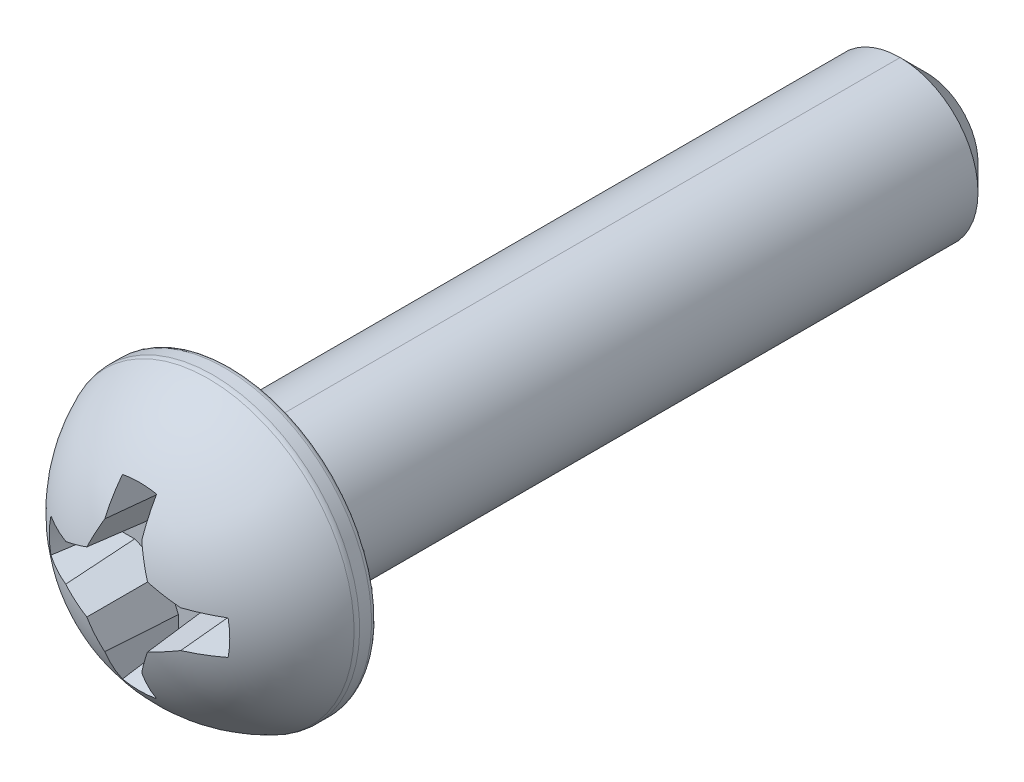
ISO-10303-21;
HEADER;
FILE_DESCRIPTION(('STEP AP214'),'2;1');
FILE_NAME('part.step','',(''),(''),'','','');
FILE_SCHEMA(('AUTOMOTIVE_DESIGN { 1 0 10303 214 1 1 1 1 }'));
ENDSEC;
DATA;
#1=APPLICATION_CONTEXT('core data for automotive mechanical design processes');
#2=APPLICATION_PROTOCOL_DEFINITION('international standard','automotive_design',2000,#1);
#3=PRODUCT_CONTEXT('',#1,'mechanical');
#4=PRODUCT('Part','Part','',(#3));
#5=PRODUCT_RELATED_PRODUCT_CATEGORY('part','',(#4));
#6=PRODUCT_DEFINITION_FORMATION('','',#4);
#7=PRODUCT_DEFINITION_CONTEXT('part definition',#1,'design');
#8=PRODUCT_DEFINITION('design','',#6,#7);
#9=PRODUCT_DEFINITION_SHAPE('','',#8);
#10=(LENGTH_UNIT() NAMED_UNIT(*) SI_UNIT(.MILLI.,.METRE.));
#11=(NAMED_UNIT(*) PLANE_ANGLE_UNIT() SI_UNIT($,.RADIAN.));
#12=(NAMED_UNIT(*) SI_UNIT($,.STERADIAN.) SOLID_ANGLE_UNIT());
#13=UNCERTAINTY_MEASURE_WITH_UNIT(LENGTH_MEASURE(1.E-05),#10,'distance_accuracy_value','');
#14=(GEOMETRIC_REPRESENTATION_CONTEXT(3) GLOBAL_UNCERTAINTY_ASSIGNED_CONTEXT((#13)) GLOBAL_UNIT_ASSIGNED_CONTEXT((#10,
#11,#12)) REPRESENTATION_CONTEXT('',''));
#15=CARTESIAN_POINT('',(0.,0.,0.));
#16=DIRECTION('',(0.,0.,1.));
#17=DIRECTION('',(1.,0.,0.));
#18=AXIS2_PLACEMENT_3D('',#15,#16,#17);
#19=CARTESIAN_POINT('',(0.,0.,2.1844));
#20=DIRECTION('',(0.,0.,-1.));
#21=DIRECTION('',(-1.,0.,0.));
#22=AXIS2_PLACEMENT_3D('',#19,#20,#21);
#23=CYLINDRICAL_SURFACE('',#22,2.6797);
#24=CARTESIAN_POINT('',(0.,0.,0.327659999999998));
#25=DIRECTION('',(0.,0.,-1.));
#26=DIRECTION('',(0.,1.,0.));
#27=AXIS2_PLACEMENT_3D('',#24,#25,#26);
#28=CIRCLE('',#27,2.6797);
#29=CARTESIAN_POINT('',(0.,2.6797,0.327659999999998));
#30=VERTEX_POINT('',#29);
#31=EDGE_CURVE('E432',#30,#30,#28,.T.);
#32=ORIENTED_EDGE('',*,*,#31,.T.);
#33=EDGE_LOOP('',(#32));
#34=FACE_BOUND('',#33,.T.);
#35=CARTESIAN_POINT('',(0.,0.,0.109219999999998));
#36=DIRECTION('',(0.,0.,-1.));
#37=DIRECTION('',(0.,1.,0.));
#38=AXIS2_PLACEMENT_3D('',#35,#36,#37);
#39=CIRCLE('',#38,2.6797);
#40=CARTESIAN_POINT('',(0.,2.6797,0.109219999999998));
#41=VERTEX_POINT('',#40);
#42=EDGE_CURVE('E430',#41,#41,#39,.T.);
#43=ORIENTED_EDGE('',*,*,#42,.F.);
#44=EDGE_LOOP('',(#43));
#45=FACE_BOUND('',#44,.T.);
#46=ADVANCED_FACE('F38',(#34,#45),#23,.T.);
#47=CARTESIAN_POINT('',(0.,0.,0.109219999999998));
#48=DIRECTION('',(0.,0.,-1.));
#49=DIRECTION('',(0.,1.,0.));
#50=AXIS2_PLACEMENT_3D('',#47,#48,#49);
#51=TOROIDAL_SURFACE('',#50,2.57048,0.10922);
#52=CARTESIAN_POINT('',(0.,0.,0.));
#53=DIRECTION('',(0.,0.,-1.));
#54=DIRECTION('',(0.,1.,0.));
#55=AXIS2_PLACEMENT_3D('',#52,#53,#54);
#56=CIRCLE('',#55,2.57048);
#57=CARTESIAN_POINT('',(0.,2.57048,0.));
#58=VERTEX_POINT('',#57);
#59=EDGE_CURVE('E444',#58,#58,#56,.T.);
#60=ORIENTED_EDGE('',*,*,#59,.F.);
#61=EDGE_LOOP('',(#60));
#62=FACE_BOUND('',#61,.T.);
#63=ORIENTED_EDGE('',*,*,#42,.T.);
#64=EDGE_LOOP('',(#63));
#65=FACE_BOUND('',#64,.T.);
#66=ADVANCED_FACE('F488',(#62,#65),#51,.T.);
#67=CARTESIAN_POINT('',(0.,0.,0.327659999999998));
#68=DIRECTION('',(0.,0.,-1.));
#69=DIRECTION('',(0.,1.,0.));
#70=AXIS2_PLACEMENT_3D('',#67,#68,#69);
#71=TOROIDAL_SURFACE('',#70,2.46126,0.21844);
#72=ORIENTED_EDGE('',*,*,#31,.F.);
#73=EDGE_LOOP('',(#72));
#74=FACE_BOUND('',#73,.T.);
#75=CARTESIAN_POINT('',(0.,0.,0.411963557261845));
#76=DIRECTION('',(0.,0.,-1.));
#77=DIRECTION('',(0.,1.,0.));
#78=AXIS2_PLACEMENT_3D('',#75,#76,#77);
#79=CIRCLE('',#78,2.6627766093229);
#80=CARTESIAN_POINT('',(0.,2.6627766093229,0.411963557261845));
#81=VERTEX_POINT('',#80);
#82=EDGE_CURVE('E441',#81,#81,#79,.T.);
#83=ORIENTED_EDGE('',*,*,#82,.T.);
#84=EDGE_LOOP('',(#83));
#85=FACE_BOUND('',#84,.T.);
#86=ADVANCED_FACE('F493',(#74,#85),#71,.T.);
#87=CARTESIAN_POINT('',(0.,0.,-0.701996930232557));
#88=DIRECTION('',(0.,0.,-1.));
#89=DIRECTION('',(0.,1.,0.));
#90=AXIS2_PLACEMENT_3D('',#87,#88,#89);
#91=SPHERICAL_SURFACE('',#90,2.88639693023256);
#92=CARTESIAN_POINT('',(-0.103970505570633,0.,-0.711093170811046));
#93=DIRECTION('',(0.996194698091746,0.,0.0871557427476584));
#94=DIRECTION('',(0.0871557427476584,0.,-0.996194698091746));
#95=AXIS2_PLACEMENT_3D('',#92,#93,#94);
#96=CIRCLE('',#95,2.88450942644233);
#97=CARTESIAN_POINT('',(-0.338123662597537,1.05001993724353,1.96528966086309));
#98=VERTEX_POINT('',#97);
#99=CARTESIAN_POINT('',(-0.312085803117818,1.61819095132128,1.66767556515793));
#100=VERTEX_POINT('',#99);
#101=EDGE_CURVE('E11',#98,#100,#96,.F.);
#102=ORIENTED_EDGE('',*,*,#101,.T.);
#103=CARTESIAN_POINT('',(0.,0.,1.66767556515793));
#104=DIRECTION('',(0.,0.,-1.));
#105=DIRECTION('',(-1.,0.,0.));
#106=AXIS2_PLACEMENT_3D('',#103,#104,#105);
#107=CIRCLE('',#106,1.6480107716413);
#108=CARTESIAN_POINT('',(0.312085803117812,1.61819095132128,1.66767556515793));
#109=VERTEX_POINT('',#108);
#110=EDGE_CURVE('E423',#100,#109,#107,.T.);
#111=ORIENTED_EDGE('',*,*,#110,.T.);
#112=CARTESIAN_POINT('',(0.103970505570634,0.,-0.711093170811047));
#113=DIRECTION('',(-0.996194698091746,0.,0.0871557427476584));
#114=DIRECTION('',(0.0871557427476584,0.,0.996194698091746));
#115=AXIS2_PLACEMENT_3D('',#112,#113,#114);
#116=CIRCLE('',#115,2.88450942644233);
#117=CARTESIAN_POINT('',(0.338123662597533,1.05001993724353,1.96528966086309));
#118=VERTEX_POINT('',#117);
#119=EDGE_CURVE('E420',#109,#118,#116,.F.);
#120=ORIENTED_EDGE('',*,*,#119,.T.);
#121=CARTESIAN_POINT('',(0.440876055590451,0.18261684155112,-0.743746590796358));
#122=DIRECTION('',(-0.920363891963224,-0.381227206369654,0.0871557427476584));
#123=DIRECTION('',(0.38268343236509,-0.923879532511287,0.));
#124=AXIS2_PLACEMENT_3D('',#121,#122,#123);
#125=CIRCLE('',#124,2.84637024954373);
#126=CARTESIAN_POINT('',(0.554047520679546,0.554047520679546,2.07601493592526));
#127=VERTEX_POINT('',#126);
#128=EDGE_CURVE('E424',#118,#127,#125,.F.);
#129=ORIENTED_EDGE('',*,*,#128,.T.);
#130=CARTESIAN_POINT('',(0.18261684155112,0.44087605559045,-0.743746590796358));
#131=DIRECTION('',(-0.381227206369654,-0.920363891963224,0.0871557427476584));
#132=DIRECTION('',(0.923879532511287,-0.382683432365091,0.));
#133=AXIS2_PLACEMENT_3D('',#130,#131,#132);
#134=CIRCLE('',#133,2.84637024954373);
#135=CARTESIAN_POINT('',(1.05001993724353,0.338123662597533,1.96528966086309));
#136=VERTEX_POINT('',#135);
#137=EDGE_CURVE('E426',#127,#136,#134,.F.);
#138=ORIENTED_EDGE('',*,*,#137,.T.);
#139=CARTESIAN_POINT('',(0.,0.103970505570633,-0.711093170811046));
#140=DIRECTION('',(0.,-0.996194698091746,0.0871557427476584));
#141=DIRECTION('',(0.,-0.0871557427476584,-0.996194698091746));
#142=AXIS2_PLACEMENT_3D('',#139,#140,#141);
#143=CIRCLE('',#142,2.88450942644233);
#144=CARTESIAN_POINT('',(1.61819095132128,0.312085803117813,1.66767556515793));
#145=VERTEX_POINT('',#144);
#146=EDGE_CURVE('E327',#136,#145,#143,.F.);
#147=ORIENTED_EDGE('',*,*,#146,.T.);
#148=CARTESIAN_POINT('',(0.,0.,1.66767556515793));
#149=DIRECTION('',(0.,0.,-1.));
#150=DIRECTION('',(-1.,0.,0.));
#151=AXIS2_PLACEMENT_3D('',#148,#149,#150);
#152=CIRCLE('',#151,1.6480107716413);
#153=CARTESIAN_POINT('',(1.61819095132129,-0.312085803117795,1.66767556515793));
#154=VERTEX_POINT('',#153);
#155=EDGE_CURVE('E429',#145,#154,#152,.T.);
#156=ORIENTED_EDGE('',*,*,#155,.T.);
#157=CARTESIAN_POINT('',(0.,-0.103970505570635,-0.711093170811047));
#158=DIRECTION('',(0.,0.996194698091746,0.0871557427476584));
#159=DIRECTION('',(0.,-0.0871557427476584,0.996194698091746));
#160=AXIS2_PLACEMENT_3D('',#157,#158,#159);
#161=CIRCLE('',#160,2.88450942644233);
#162=CARTESIAN_POINT('',(1.05001993724353,-0.338123662597523,1.96528966086309));
#163=VERTEX_POINT('',#162);
#164=EDGE_CURVE('E205',#154,#163,#161,.F.);
#165=ORIENTED_EDGE('',*,*,#164,.T.);
#166=CARTESIAN_POINT('',(0.182616841551124,-0.440876055590449,-0.743746590796358));
#167=DIRECTION('',(-0.381227206369664,0.92036389196322,0.0871557427476584));
#168=DIRECTION('',(-0.923879532511283,-0.3826834323651,0.));
#169=AXIS2_PLACEMENT_3D('',#166,#167,#168);
#170=CIRCLE('',#169,2.84637024954373);
#171=CARTESIAN_POINT('',(0.554047520679552,-0.55404752067954,2.07601493592526));
#172=VERTEX_POINT('',#171);
#173=EDGE_CURVE('E400',#163,#172,#170,.F.);
#174=ORIENTED_EDGE('',*,*,#173,.T.);
#175=CARTESIAN_POINT('',(0.440876055590453,-0.182616841551115,-0.743746590796358));
#176=DIRECTION('',(-0.920363891963228,0.381227206369645,0.0871557427476584));
#177=DIRECTION('',(-0.382683432365081,-0.923879532511291,0.));
#178=AXIS2_PLACEMENT_3D('',#175,#176,#177);
#179=CIRCLE('',#178,2.84637024954373);
#180=CARTESIAN_POINT('',(0.338123662597544,-1.05001993724353,1.96528966086309));
#181=VERTEX_POINT('',#180);
#182=EDGE_CURVE('E569',#172,#181,#179,.F.);
#183=ORIENTED_EDGE('',*,*,#182,.T.);
#184=CARTESIAN_POINT('',(0.103970505570633,0.,-0.711093170811046));
#185=DIRECTION('',(-0.996194698091746,0.,0.0871557427476584));
#186=DIRECTION('',(0.0871557427476584,0.,0.996194698091746));
#187=AXIS2_PLACEMENT_3D('',#184,#185,#186);
#188=CIRCLE('',#187,2.88450942644233);
#189=CARTESIAN_POINT('',(0.31208580311783,-1.61819095132128,1.66767556515793));
#190=VERTEX_POINT('',#189);
#191=EDGE_CURVE('E226',#181,#190,#188,.F.);
#192=ORIENTED_EDGE('',*,*,#191,.T.);
#193=CARTESIAN_POINT('',(0.,0.,1.66767556515793));
#194=DIRECTION('',(0.,0.,-1.));
#195=DIRECTION('',(-1.,0.,0.));
#196=AXIS2_PLACEMENT_3D('',#193,#194,#195);
#197=CIRCLE('',#196,1.6480107716413);
#198=CARTESIAN_POINT('',(-0.3120858031178,-1.61819095132128,1.66767556515793));
#199=VERTEX_POINT('',#198);
#200=EDGE_CURVE('E396',#190,#199,#197,.T.);
#201=ORIENTED_EDGE('',*,*,#200,.T.);
#202=CARTESIAN_POINT('',(-0.103970505570634,0.,-0.711093170811047));
#203=DIRECTION('',(0.996194698091746,0.,0.0871557427476584));
#204=DIRECTION('',(0.0871557427476584,0.,-0.996194698091746));
#205=AXIS2_PLACEMENT_3D('',#202,#203,#204);
#206=CIRCLE('',#205,2.88450942644233);
#207=CARTESIAN_POINT('',(-0.338123662597526,-1.05001993724353,1.96528966086309));
#208=VERTEX_POINT('',#207);
#209=EDGE_CURVE('E259',#199,#208,#206,.F.);
#210=ORIENTED_EDGE('',*,*,#209,.T.);
#211=CARTESIAN_POINT('',(-0.440876055590449,-0.182616841551122,-0.743746590796358));
#212=DIRECTION('',(0.920363891963221,0.38122720636966,0.0871557427476584));
#213=DIRECTION('',(-0.382683432365097,0.923879532511284,0.));
#214=AXIS2_PLACEMENT_3D('',#211,#212,#213);
#215=CIRCLE('',#214,2.84637024954373);
#216=CARTESIAN_POINT('',(-0.554047520679542,-0.55404752067955,2.07601493592526));
#217=VERTEX_POINT('',#216);
#218=EDGE_CURVE('E394',#208,#217,#215,.F.);
#219=ORIENTED_EDGE('',*,*,#218,.T.);
#220=CARTESIAN_POINT('',(-0.182616841551117,-0.440876055590452,-0.743746590796358));
#221=DIRECTION('',(0.381227206369648,0.920363891963227,0.0871557427476584));
#222=DIRECTION('',(-0.923879532511289,0.382683432365084,0.));
#223=AXIS2_PLACEMENT_3D('',#220,#221,#222);
#224=CIRCLE('',#223,2.84637024954373);
#225=CARTESIAN_POINT('',(-1.05001993724353,-0.338123662597541,1.96528966086309));
#226=VERTEX_POINT('',#225);
#227=EDGE_CURVE('E383',#217,#226,#224,.F.);
#228=ORIENTED_EDGE('',*,*,#227,.T.);
#229=CARTESIAN_POINT('',(0.,-0.103970505570633,-0.711093170811046));
#230=DIRECTION('',(0.,0.996194698091746,0.0871557427476584));
#231=DIRECTION('',(0.,-0.0871557427476584,0.996194698091746));
#232=AXIS2_PLACEMENT_3D('',#229,#230,#231);
#233=CIRCLE('',#232,2.88450942644233);
#234=CARTESIAN_POINT('',(-1.61819095132128,-0.312085803117824,1.66767556515793));
#235=VERTEX_POINT('',#234);
#236=EDGE_CURVE('E285',#226,#235,#233,.F.);
#237=ORIENTED_EDGE('',*,*,#236,.T.);
#238=CARTESIAN_POINT('',(0.,0.,1.66767556515793));
#239=DIRECTION('',(0.,0.,-1.));
#240=DIRECTION('',(-1.,0.,0.));
#241=AXIS2_PLACEMENT_3D('',#238,#239,#240);
#242=CIRCLE('',#241,1.6480107716413);
#243=CARTESIAN_POINT('',(-1.61819095132128,0.312085803117806,1.66767556515793));
#244=VERTEX_POINT('',#243);
#245=EDGE_CURVE('E395',#235,#244,#242,.T.);
#246=ORIENTED_EDGE('',*,*,#245,.T.);
#247=CARTESIAN_POINT('',(0.,0.103970505570634,-0.711093170811047));
#248=DIRECTION('',(0.,-0.996194698091746,0.0871557427476584));
#249=DIRECTION('',(0.,-0.0871557427476584,-0.996194698091746));
#250=AXIS2_PLACEMENT_3D('',#247,#248,#249);
#251=CIRCLE('',#250,2.88450942644233);
#252=CARTESIAN_POINT('',(-1.05001993724353,0.338123662597529,1.96528966086309));
#253=VERTEX_POINT('',#252);
#254=EDGE_CURVE('E308',#244,#253,#251,.F.);
#255=ORIENTED_EDGE('',*,*,#254,.T.);
#256=CARTESIAN_POINT('',(-0.182616841551121,0.44087605559045,-0.743746590796358));
#257=DIRECTION('',(0.381227206369657,-0.920363891963223,0.0871557427476584));
#258=DIRECTION('',(0.923879532511285,0.382683432365093,0.));
#259=AXIS2_PLACEMENT_3D('',#256,#257,#258);
#260=CIRCLE('',#259,2.84637024954373);
#261=CARTESIAN_POINT('',(-0.554047520679548,0.554047520679544,2.07601493592526));
#262=VERTEX_POINT('',#261);
#263=EDGE_CURVE('E549',#253,#262,#260,.F.);
#264=ORIENTED_EDGE('',*,*,#263,.T.);
#265=CARTESIAN_POINT('',(-0.440876055590452,0.182616841551118,-0.743746590796358));
#266=DIRECTION('',(0.920363891963225,-0.381227206369651,0.0871557427476584));
#267=DIRECTION('',(0.382683432365087,0.923879532511288,0.));
#268=AXIS2_PLACEMENT_3D('',#265,#266,#267);
#269=CIRCLE('',#268,2.84637024954373);
#270=EDGE_CURVE('E48',#262,#98,#269,.F.);
#271=ORIENTED_EDGE('',*,*,#270,.T.);
#272=EDGE_LOOP('',(#102,#111,#120,#129,#138,#147,#156,#165,#174,#183,#192,#201,#210,#219,#228,
#237,#246,#255,#264,#271));
#273=FACE_BOUND('',#272,.T.);
#274=ORIENTED_EDGE('',*,*,#82,.F.);
#275=EDGE_LOOP('',(#274));
#276=FACE_BOUND('',#275,.T.);
#277=ADVANCED_FACE('F390',(#273,#276),#91,.T.);
#278=CARTESIAN_POINT('',(0.,0.,0.));
#279=DIRECTION('',(0.,0.,1.));
#280=DIRECTION('',(1.,0.,0.));
#281=AXIS2_PLACEMENT_3D('',#278,#279,#280);
#282=PLANE('',#281);
#283=CARTESIAN_POINT('',(0.,0.,0.));
#284=DIRECTION('',(0.,0.,1.));
#285=DIRECTION('',(1.,0.,0.));
#286=AXIS2_PLACEMENT_3D('',#283,#284,#285);
#287=CIRCLE('',#286,1.42239999999999);
#288=CARTESIAN_POINT('',(0.,1.4224,0.));
#289=VERTEX_POINT('',#288);
#290=CARTESIAN_POINT('',(0.,-1.42239999999999,0.));
#291=VERTEX_POINT('',#290);
#292=EDGE_CURVE('E461',#289,#291,#287,.T.);
#293=ORIENTED_EDGE('',*,*,#292,.T.);
#294=EDGE_CURVE('E56',#291,#289,#287,.T.);
#295=ORIENTED_EDGE('',*,*,#294,.T.);
#296=EDGE_LOOP('',(#293,#295));
#297=FACE_BOUND('',#296,.T.);
#298=ORIENTED_EDGE('',*,*,#59,.T.);
#299=EDGE_LOOP('',(#298));
#300=FACE_BOUND('',#299,.T.);
#301=ADVANCED_FACE('F477',(#297,#300),#282,.F.);
#302=CARTESIAN_POINT('',(0.,0.,0.));
#303=DIRECTION('',(0.,0.,1.));
#304=DIRECTION('',(1.,0.,0.));
#305=AXIS2_PLACEMENT_3D('',#302,#303,#304);
#306=CYLINDRICAL_SURFACE('',#305,1.4224);
#307=DIRECTION('',(0.,0.,1.));
#308=VECTOR('',#307,1.);
#309=CARTESIAN_POINT('',(0.,1.4224,0.));
#310=LINE('',#309,#308);
#311=CARTESIAN_POINT('',(0.,1.4224,-12.22375));
#312=VERTEX_POINT('',#311);
#313=EDGE_CURVE('E447',#312,#289,#310,.T.);
#314=ORIENTED_EDGE('',*,*,#313,.F.);
#315=CARTESIAN_POINT('',(0.,0.,-12.22375));
#316=DIRECTION('',(0.,0.,1.));
#317=DIRECTION('',(1.,0.,0.));
#318=AXIS2_PLACEMENT_3D('',#315,#316,#317);
#319=CIRCLE('',#318,1.4224);
#320=CARTESIAN_POINT('',(0.,-1.4224,-12.22375));
#321=VERTEX_POINT('',#320);
#322=EDGE_CURVE('E457',#312,#321,#319,.T.);
#323=ORIENTED_EDGE('',*,*,#322,.T.);
#324=DIRECTION('',(0.,0.,1.));
#325=VECTOR('',#324,1.);
#326=CARTESIAN_POINT('',(0.,-1.4224,0.));
#327=LINE('',#326,#325);
#328=EDGE_CURVE('E448',#291,#321,#327,.F.);
#329=ORIENTED_EDGE('',*,*,#328,.F.);
#330=ORIENTED_EDGE('',*,*,#292,.F.);
#331=EDGE_LOOP('',(#314,#323,#329,#330));
#332=FACE_BOUND('',#331,.T.);
#333=ADVANCED_FACE('F474',(#332),#306,.T.);
#334=CARTESIAN_POINT('',(0.,0.,-12.7));
#335=DIRECTION('',(0.,0.,1.));
#336=DIRECTION('',(1.,0.,0.));
#337=AXIS2_PLACEMENT_3D('',#334,#335,#336);
#338=PLANE('',#337);
#339=CARTESIAN_POINT('',(0.,0.,-12.7));
#340=DIRECTION('',(0.,0.,1.));
#341=DIRECTION('',(1.,0.,0.));
#342=AXIS2_PLACEMENT_3D('',#339,#340,#341);
#343=CIRCLE('',#342,0.946149999999998);
#344=CARTESIAN_POINT('',(0.946149999999998,0.,-12.7));
#345=VERTEX_POINT('',#344);
#346=EDGE_CURVE('E452',#345,#345,#343,.F.);
#347=ORIENTED_EDGE('',*,*,#346,.T.);
#348=EDGE_LOOP('',(#347));
#349=FACE_BOUND('',#348,.T.);
#350=ADVANCED_FACE('F476',(#349),#338,.F.);
#351=EDGE_CURVE('E460',#321,#312,#319,.T.);
#352=ORIENTED_EDGE('',*,*,#351,.T.);
#353=ORIENTED_EDGE('',*,*,#313,.T.);
#354=ORIENTED_EDGE('',*,*,#294,.F.);
#355=ORIENTED_EDGE('',*,*,#328,.T.);
#356=EDGE_LOOP('',(#352,#353,#354,#355));
#357=FACE_BOUND('',#356,.T.);
#358=ADVANCED_FACE('F468',(#357),#306,.T.);
#359=CARTESIAN_POINT('',(0.,0.,-12.22375));
#360=DIRECTION('',(0.,0.,1.));
#361=DIRECTION('',(1.,0.,0.));
#362=AXIS2_PLACEMENT_3D('',#359,#360,#361);
#363=CONICAL_SURFACE('',#362,1.4224,0.785398163397451);
#364=ORIENTED_EDGE('',*,*,#346,.F.);
#365=EDGE_LOOP('',(#364));
#366=FACE_BOUND('',#365,.T.);
#367=ORIENTED_EDGE('',*,*,#322,.F.);
#368=ORIENTED_EDGE('',*,*,#351,.F.);
#369=EDGE_LOOP('',(#367,#368));
#370=FACE_BOUND('',#369,.T.);
#371=ADVANCED_FACE('F472',(#366,#370),#363,.T.);
#372=CARTESIAN_POINT('',(0.,0.,2.1844));
#373=DIRECTION('',(0.,0.,1.));
#374=DIRECTION('',(1.,0.,0.));
#375=AXIS2_PLACEMENT_3D('',#372,#373,#374);
#376=CONICAL_SURFACE('',#375,1.78646666666667,0.26179938779915);
#377=ORIENTED_EDGE('',*,*,#110,.F.);
#378=CARTESIAN_POINT('',(-0.312085803117818,1.61819095132128,1.66767556515793));
#379=CARTESIAN_POINT('',(-0.293658702680727,1.56426559260076,1.45705284337374));
#380=CARTESIAN_POINT('',(-0.275232673657156,1.5102919416055,1.24644236790213));
#381=CARTESIAN_POINT('',(-0.238383983809261,1.40219453051685,0.825259915652463));
#382=CARTESIAN_POINT('',(-0.219961322981076,1.34807077059666,0.614687938830276));
#383=CARTESIAN_POINT('',(-0.183120537650791,1.23961944959332,0.193595835630329));
#384=CARTESIAN_POINT('',(-0.164702413152332,1.1852918883472,-0.0169242907058252));
#385=CARTESIAN_POINT('',(-0.127873401457194,1.07631386587562,-0.437881820640253));
#386=CARTESIAN_POINT('',(-0.109462514269159,1.02166340426576,-0.648319224139732));
#387=CARTESIAN_POINT('',(-0.0910566107892075,0.966791986018171,-0.858699663595149));
#388=B_SPLINE_CURVE_WITH_KNOTS('',3,(#378,#379,#380,#381,#382,#383,#384,#385,#386,#387),
.UNSPECIFIED.,.F.,.F.,(4,2,2,2,4),(0.,0.654587601752619,1.30917444851526,1.9637618188231,
2.61834996854005),.UNSPECIFIED.);
#389=CARTESIAN_POINT('',(-0.229886508929319,1.37720641225284,0.728133333333333));
#390=VERTEX_POINT('',#389);
#391=EDGE_CURVE('E346',#390,#100,#388,.F.);
#392=ORIENTED_EDGE('',*,*,#391,.F.);
#393=CARTESIAN_POINT('',(0.,0.,0.728133333333333));
#394=DIRECTION('',(0.,0.,1.));
#395=DIRECTION('',(1.,0.,0.));
#396=AXIS2_PLACEMENT_3D('',#393,#394,#395);
#397=CIRCLE('',#396,1.39626118936897);
#398=CARTESIAN_POINT('',(0.229886508929314,1.37720641225284,0.728133333333333));
#399=VERTEX_POINT('',#398);
#400=EDGE_CURVE('E326',#399,#390,#397,.T.);
#401=ORIENTED_EDGE('',*,*,#400,.F.);
#402=CARTESIAN_POINT('',(0.10306577367147,1.00256695699257,-0.72143430373847));
#403=CARTESIAN_POINT('',(0.125581267698522,1.06954684472901,-0.464081029386759));
#404=CARTESIAN_POINT('',(0.148103183803029,1.1362413072748,-0.20665435035384));
#405=CARTESIAN_POINT('',(0.19315606649284,1.26922579681641,0.308302455180875));
#406=CARTESIAN_POINT('',(0.215687033069938,1.33551582417806,0.565832581588873));
#407=CARTESIAN_POINT('',(0.249217759163122,1.43398046169886,0.94909053458353));
#408=CARTESIAN_POINT('',(0.260215500771876,1.46624569103956,1.07479529638383));
#409=CARTESIAN_POINT('',(0.299248883628363,1.58067212801934,1.52094890398719));
#410=CARTESIAN_POINT('',(0.327287435844744,1.66270262136074,1.84143102231413));
#411=CARTESIAN_POINT('',(0.383369054918465,1.82655964382033,2.4824468615503));
#412=CARTESIAN_POINT('',(0.411412121773807,1.90838617302853,2.80298058243669));
#413=CARTESIAN_POINT('',(0.439456275185721,1.99016326493147,3.12352672272152));
#414=B_SPLINE_CURVE_WITH_KNOTS('',3,(#402,#403,#404,#405,#406,#407,#408,#409,#410,#411,#412,
#413),.UNSPECIFIED.,.F.,.F.,(4,2,2,2,2,4),(0.,0.80063393742104,1.60126715053208,
1.99200125888106,2.98800092929224,3.98400016001327),.UNSPECIFIED.);
#415=EDGE_CURVE('E409',#399,#109,#414,.T.);
#416=ORIENTED_EDGE('',*,*,#415,.T.);
#417=EDGE_LOOP('',(#377,#392,#401,#416));
#418=FACE_BOUND('',#417,.T.);
#419=ADVANCED_FACE('F295',(#418),#376,.F.);
#420=CARTESIAN_POINT('',(0.357293333333333,0.,2.1844));
#421=DIRECTION('',(-0.996194698091746,0.,0.0871557427476584));
#422=DIRECTION('',(0.0871557427476584,0.,0.996194698091746));
#423=AXIS2_PLACEMENT_3D('',#420,#421,#422);
#424=PLANE('',#423);
#425=ORIENTED_EDGE('',*,*,#415,.F.);
#426=DIRECTION('',(0.,-1.,0.));
#427=VECTOR('',#426,1.);
#428=CARTESIAN_POINT('',(0.229886508929314,0.,0.728133333333333));
#429=LINE('',#428,#427);
#430=CARTESIAN_POINT('',(0.229886508929314,1.02849022876895,0.728133333333333));
#431=VERTEX_POINT('',#430);
#432=EDGE_CURVE('E336',#431,#399,#429,.F.);
#433=ORIENTED_EDGE('',*,*,#432,.F.);
#434=DIRECTION('',(0.0871426484044397,0.0173337504938602,0.996045029063886));
#435=VECTOR('',#434,1.);
#436=CARTESIAN_POINT('',(0.35570150914859,1.05351638831444,2.16620536631159));
#437=LINE('',#436,#435);
#438=EDGE_CURVE('E406',#431,#118,#437,.T.);
#439=ORIENTED_EDGE('',*,*,#438,.T.);
#440=ORIENTED_EDGE('',*,*,#119,.F.);
#441=EDGE_LOOP('',(#425,#433,#439,#440));
#442=FACE_BOUND('',#441,.T.);
#443=ADVANCED_FACE('F242',(#442),#424,.T.);
#444=CARTESIAN_POINT('',(0.677555174090714,0.280652542364438,2.1844));
#445=DIRECTION('',(-0.920363891963224,-0.381227206369654,0.0871557427476584));
#446=DIRECTION('',(0.38268343236509,-0.923879532511287,0.));
#447=AXIS2_PLACEMENT_3D('',#444,#445,#446);
#448=PLANE('',#447);
#449=ORIENTED_EDGE('',*,*,#438,.F.);
#450=DIRECTION('',(0.38268343236509,-0.923879532511287,0.));
#451=VECTOR('',#450,1.);
#452=CARTESIAN_POINT('',(0.559846616721581,0.231896061494771,0.728133333333333));
#453=LINE('',#452,#451);
#454=CARTESIAN_POINT('',(0.463792122989542,0.463792122989542,0.728133333333333));
#455=VERTEX_POINT('',#454);
#456=EDGE_CURVE('E333',#455,#431,#453,.F.);
#457=ORIENTED_EDGE('',*,*,#456,.F.);
#458=DIRECTION('',(0.0666626913468324,0.0666626913468323,0.995546167269401));
#459=VECTOR('',#458,1.);
#460=CARTESIAN_POINT('',(0.560574494297687,0.560574494297687,2.17348930184309));
#461=LINE('',#460,#459);
#462=EDGE_CURVE('E410',#455,#127,#461,.T.);
#463=ORIENTED_EDGE('',*,*,#462,.T.);
#464=ORIENTED_EDGE('',*,*,#128,.F.);
#465=EDGE_LOOP('',(#449,#457,#463,#464));
#466=FACE_BOUND('',#465,.T.);
#467=ADVANCED_FACE('F520',(#466),#448,.T.);
#468=CARTESIAN_POINT('',(0.280652542364438,0.677555174090714,2.1844));
#469=DIRECTION('',(-0.381227206369654,-0.920363891963224,0.0871557427476584));
#470=DIRECTION('',(0.923879532511287,-0.382683432365091,0.));
#471=AXIS2_PLACEMENT_3D('',#468,#469,#470);
#472=PLANE('',#471);
#473=ORIENTED_EDGE('',*,*,#462,.F.);
#474=DIRECTION('',(0.923879532511287,-0.382683432365091,0.));
#475=VECTOR('',#474,1.);
#476=CARTESIAN_POINT('',(0.231896061494771,0.559846616721581,0.728133333333333));
#477=LINE('',#476,#475);
#478=CARTESIAN_POINT('',(1.02849022876895,0.229886508929314,0.728133333333333));
#479=VERTEX_POINT('',#478);
#480=EDGE_CURVE('E330',#479,#455,#477,.F.);
#481=ORIENTED_EDGE('',*,*,#480,.F.);
#482=DIRECTION('',(0.0173337504938602,0.0871426484044397,0.996045029063886));
#483=VECTOR('',#482,1.);
#484=CARTESIAN_POINT('',(1.05408447123908,0.358557454870428,2.19884897528605));
#485=LINE('',#484,#483);
#486=EDGE_CURVE('E325',#479,#136,#485,.T.);
#487=ORIENTED_EDGE('',*,*,#486,.T.);
#488=ORIENTED_EDGE('',*,*,#137,.F.);
#489=EDGE_LOOP('',(#473,#481,#487,#488));
#490=FACE_BOUND('',#489,.T.);
#491=ADVANCED_FACE('F317',(#490),#472,.T.);
#492=CARTESIAN_POINT('',(0.,0.357293333333331,2.1844));
#493=DIRECTION('',(0.,-0.996194698091746,0.0871557427476584));
#494=DIRECTION('',(0.,-0.0871557427476584,-0.996194698091746));
#495=AXIS2_PLACEMENT_3D('',#492,#493,#494);
#496=PLANE('',#495);
#497=ORIENTED_EDGE('',*,*,#486,.F.);
#498=DIRECTION('',(1.,0.,0.));
#499=VECTOR('',#498,1.);
#500=CARTESIAN_POINT('',(0.,0.229886508929312,0.728133333333333));
#501=LINE('',#500,#499);
#502=CARTESIAN_POINT('',(1.37720641225284,0.229886508929314,0.728133333333333));
#503=VERTEX_POINT('',#502);
#504=EDGE_CURVE('E197',#503,#479,#501,.F.);
#505=ORIENTED_EDGE('',*,*,#504,.F.);
#506=CARTESIAN_POINT('',(1.61819095132128,0.312085803117812,1.66767556515793));
#507=CARTESIAN_POINT('',(1.56426559260076,0.293658702680721,1.45705284337374));
#508=CARTESIAN_POINT('',(1.5102919416055,0.275232673657151,1.24644236790213));
#509=CARTESIAN_POINT('',(1.40219453051685,0.238383983809256,0.825259915652464));
#510=CARTESIAN_POINT('',(1.34807077059666,0.219961322981071,0.614687938830277));
#511=CARTESIAN_POINT('',(1.23961944959332,0.183120537650787,0.19359583563033));
#512=CARTESIAN_POINT('',(1.1852918883472,0.164702413152328,-0.016924290705825));
#513=CARTESIAN_POINT('',(1.07631386587562,0.12787340145719,-0.437881820640253));
#514=CARTESIAN_POINT('',(1.02166340426576,0.109462514269155,-0.648319224139731));
#515=CARTESIAN_POINT('',(0.966791986018172,0.091056610789204,-0.858699663595148));
#516=B_SPLINE_CURVE_WITH_KNOTS('',3,(#506,#507,#508,#509,#510,#511,#512,#513,#514,#515),
.UNSPECIFIED.,.F.,.F.,(4,2,2,2,4),(0.,0.654587601752619,1.30917444851526,1.9637618188231,
2.61834996854005),.UNSPECIFIED.);
#517=EDGE_CURVE('E192',#503,#145,#516,.F.);
#518=ORIENTED_EDGE('',*,*,#517,.T.);
#519=ORIENTED_EDGE('',*,*,#146,.F.);
#520=EDGE_LOOP('',(#497,#505,#518,#519));
#521=FACE_BOUND('',#520,.T.);
#522=ADVANCED_FACE('F314',(#521),#496,.T.);
#523=CARTESIAN_POINT('',(0.,0.,2.1844));
#524=DIRECTION('',(0.,0.,1.));
#525=DIRECTION('',(1.,0.,0.));
#526=AXIS2_PLACEMENT_3D('',#523,#524,#525);
#527=CONICAL_SURFACE('',#526,1.78646666666667,0.26179938779915);
#528=ORIENTED_EDGE('',*,*,#517,.F.);
#529=CARTESIAN_POINT('',(0.,0.,0.728133333333333));
#530=DIRECTION('',(0.,0.,1.));
#531=DIRECTION('',(1.,0.,0.));
#532=AXIS2_PLACEMENT_3D('',#529,#530,#531);
#533=CIRCLE('',#532,1.39626118936897);
#534=CARTESIAN_POINT('',(1.37720641225284,-0.2298865089293,0.728133333333333));
#535=VERTEX_POINT('',#534);
#536=EDGE_CURVE('E187',#535,#503,#533,.T.);
#537=ORIENTED_EDGE('',*,*,#536,.F.);
#538=CARTESIAN_POINT('',(1.00256695699258,-0.10306577367146,-0.72143430373847));
#539=CARTESIAN_POINT('',(1.06954684472901,-0.125581267698511,-0.464081029386758));
#540=CARTESIAN_POINT('',(1.1362413072748,-0.148103183803017,-0.206654350353839));
#541=CARTESIAN_POINT('',(1.26922579681641,-0.193156066492827,0.308302455180875));
#542=CARTESIAN_POINT('',(1.33551582417806,-0.215687033069925,0.565832581588873));
#543=CARTESIAN_POINT('',(1.43398046169887,-0.249217759163108,0.94909053458353));
#544=CARTESIAN_POINT('',(1.46624569103956,-0.260215500771861,1.07479529638384));
#545=CARTESIAN_POINT('',(1.58067212801934,-0.299248883628347,1.52094890398719));
#546=CARTESIAN_POINT('',(1.66270262136075,-0.327287435844727,1.84143102231413));
#547=CARTESIAN_POINT('',(1.82655964382033,-0.383369054918447,2.4824468615503));
#548=CARTESIAN_POINT('',(1.90838617302854,-0.411412121773788,2.80298058243669));
#549=CARTESIAN_POINT('',(1.99016326493148,-0.4394562751857,3.12352672272153));
#550=B_SPLINE_CURVE_WITH_KNOTS('',3,(#538,#539,#540,#541,#542,#543,#544,#545,#546,#547,#548,
#549),.UNSPECIFIED.,.F.,.F.,(4,2,2,2,2,4),(0.,0.800633937421041,1.60126715053208,
1.99200125888106,2.98800092929224,3.98400016001328),.UNSPECIFIED.);
#551=EDGE_CURVE('E190',#535,#154,#550,.T.);
#552=ORIENTED_EDGE('',*,*,#551,.T.);
#553=ORIENTED_EDGE('',*,*,#155,.F.);
#554=EDGE_LOOP('',(#528,#537,#552,#553));
#555=FACE_BOUND('',#554,.T.);
#556=ADVANCED_FACE('F189',(#555),#527,.F.);
#557=CARTESIAN_POINT('',(0.,0.,0.728133333333333));
#558=DIRECTION('',(0.,0.,1.));
#559=DIRECTION('',(1.,0.,0.));
#560=AXIS2_PLACEMENT_3D('',#557,#558,#559);
#561=PLANE('',#560);
#562=ORIENTED_EDGE('',*,*,#400,.T.);
#563=DIRECTION('',(0.,1.,0.));
#564=VECTOR('',#563,1.);
#565=CARTESIAN_POINT('',(-0.229886508929313,0.,0.728133333333333));
#566=LINE('',#565,#564);
#567=CARTESIAN_POINT('',(-0.229886508929318,1.02849022876895,0.728133333333333));
#568=VERTEX_POINT('',#567);
#569=EDGE_CURVE('E255',#390,#568,#566,.F.);
#570=ORIENTED_EDGE('',*,*,#569,.T.);
#571=DIRECTION('',(0.382683432365087,0.923879532511288,0.));
#572=VECTOR('',#571,1.);
#573=CARTESIAN_POINT('',(-0.559846616721582,0.23189606149477,0.728133333333333));
#574=LINE('',#573,#572);
#575=CARTESIAN_POINT('',(-0.463792122989544,0.46379212298954,0.728133333333333));
#576=VERTEX_POINT('',#575);
#577=EDGE_CURVE('E365',#568,#576,#574,.F.);
#578=ORIENTED_EDGE('',*,*,#577,.T.);
#579=DIRECTION('',(0.923879532511285,0.382683432365093,0.));
#580=VECTOR('',#579,1.);
#581=CARTESIAN_POINT('',(-0.231896061494773,0.559846616721581,0.728133333333333));
#582=LINE('',#581,#580);
#583=CARTESIAN_POINT('',(-1.02849022876895,0.22988650892931,0.728133333333333));
#584=VERTEX_POINT('',#583);
#585=EDGE_CURVE('E368',#576,#584,#582,.F.);
#586=ORIENTED_EDGE('',*,*,#585,.T.);
#587=DIRECTION('',(1.,0.,0.));
#588=VECTOR('',#587,1.);
#589=CARTESIAN_POINT('',(0.,0.229886508929314,0.728133333333333));
#590=LINE('',#589,#588);
#591=CARTESIAN_POINT('',(-1.37720641225284,0.229886508929309,0.728133333333333));
#592=VERTEX_POINT('',#591);
#593=EDGE_CURVE('E356',#584,#592,#590,.F.);
#594=ORIENTED_EDGE('',*,*,#593,.T.);
#595=CARTESIAN_POINT('',(0.,0.,0.728133333333333));
#596=DIRECTION('',(0.,0.,1.));
#597=DIRECTION('',(1.,0.,0.));
#598=AXIS2_PLACEMENT_3D('',#595,#596,#597);
#599=CIRCLE('',#598,1.39626118936897);
#600=CARTESIAN_POINT('',(-1.37720641225284,-0.229886508929324,0.728133333333333));
#601=VERTEX_POINT('',#600);
#602=EDGE_CURVE('E351',#592,#601,#599,.T.);
#603=ORIENTED_EDGE('',*,*,#602,.T.);
#604=DIRECTION('',(-1.,0.,0.));
#605=VECTOR('',#604,1.);
#606=CARTESIAN_POINT('',(0.,-0.229886508929313,0.728133333333333));
#607=LINE('',#606,#605);
#608=CARTESIAN_POINT('',(-1.02849022876895,-0.229886508929322,0.728133333333333));
#609=VERTEX_POINT('',#608);
#610=EDGE_CURVE('E206',#601,#609,#607,.F.);
#611=ORIENTED_EDGE('',*,*,#610,.T.);
#612=DIRECTION('',(-0.923879532511289,0.382683432365084,0.));
#613=VECTOR('',#612,1.);
#614=CARTESIAN_POINT('',(-0.231896061494768,-0.559846616721583,0.728133333333333));
#615=LINE('',#614,#613);
#616=CARTESIAN_POINT('',(-0.463792122989539,-0.463792122989546,0.728133333333333));
#617=VERTEX_POINT('',#616);
#618=EDGE_CURVE('E385',#609,#617,#615,.F.);
#619=ORIENTED_EDGE('',*,*,#618,.T.);
#620=DIRECTION('',(-0.382683432365097,0.923879532511284,0.));
#621=VECTOR('',#620,1.);
#622=CARTESIAN_POINT('',(-0.55984661672158,-0.231896061494775,0.728133333333333));
#623=LINE('',#622,#621);
#624=CARTESIAN_POINT('',(-0.229886508929307,-1.02849022876895,0.728133333333333));
#625=VERTEX_POINT('',#624);
#626=EDGE_CURVE('E553',#617,#625,#623,.F.);
#627=ORIENTED_EDGE('',*,*,#626,.T.);
#628=DIRECTION('',(0.,1.,0.));
#629=VECTOR('',#628,1.);
#630=CARTESIAN_POINT('',(-0.229886508929314,0.,0.728133333333333));
#631=LINE('',#630,#629);
#632=CARTESIAN_POINT('',(-0.229886508929304,-1.37720641225284,0.728133333333333));
#633=VERTEX_POINT('',#632);
#634=EDGE_CURVE('E405',#625,#633,#631,.F.);
#635=ORIENTED_EDGE('',*,*,#634,.T.);
#636=CARTESIAN_POINT('',(0.,0.,0.728133333333333));
#637=DIRECTION('',(0.,0.,1.));
#638=DIRECTION('',(1.,0.,0.));
#639=AXIS2_PLACEMENT_3D('',#636,#637,#638);
#640=CIRCLE('',#639,1.39626118936897);
#641=CARTESIAN_POINT('',(0.229886508929329,-1.37720641225284,0.728133333333333));
#642=VERTEX_POINT('',#641);
#643=EDGE_CURVE('E284',#633,#642,#640,.T.);
#644=ORIENTED_EDGE('',*,*,#643,.T.);
#645=DIRECTION('',(0.,-1.,0.));
#646=VECTOR('',#645,1.);
#647=CARTESIAN_POINT('',(0.229886508929313,0.,0.728133333333333));
#648=LINE('',#647,#646);
#649=CARTESIAN_POINT('',(0.229886508929325,-1.02849022876895,0.728133333333333));
#650=VERTEX_POINT('',#649);
#651=EDGE_CURVE('E216',#642,#650,#648,.F.);
#652=ORIENTED_EDGE('',*,*,#651,.T.);
#653=DIRECTION('',(-0.382683432365081,-0.923879532511291,0.));
#654=VECTOR('',#653,1.);
#655=CARTESIAN_POINT('',(0.559846616721584,-0.231896061494765,0.728133333333333));
#656=LINE('',#655,#654);
#657=CARTESIAN_POINT('',(0.463792122989547,-0.463792122989537,0.728133333333333));
#658=VERTEX_POINT('',#657);
#659=EDGE_CURVE('E215',#650,#658,#656,.F.);
#660=ORIENTED_EDGE('',*,*,#659,.T.);
#661=DIRECTION('',(-0.923879532511283,-0.3826834323651,0.));
#662=VECTOR('',#661,1.);
#663=CARTESIAN_POINT('',(0.231896061494777,-0.559846616721579,0.728133333333333));
#664=LINE('',#663,#662);
#665=CARTESIAN_POINT('',(1.02849022876895,-0.229886508929304,0.728133333333333));
#666=VERTEX_POINT('',#665);
#667=EDGE_CURVE('E210',#658,#666,#664,.F.);
#668=ORIENTED_EDGE('',*,*,#667,.T.);
#669=DIRECTION('',(-1.,0.,0.));
#670=VECTOR('',#669,1.);
#671=CARTESIAN_POINT('',(0.,-0.229886508929314,0.728133333333333));
#672=LINE('',#671,#670);
#673=EDGE_CURVE('E42',#666,#535,#672,.F.);
#674=ORIENTED_EDGE('',*,*,#673,.T.);
#675=ORIENTED_EDGE('',*,*,#536,.T.);
#676=ORIENTED_EDGE('',*,*,#504,.T.);
#677=ORIENTED_EDGE('',*,*,#480,.T.);
#678=ORIENTED_EDGE('',*,*,#456,.T.);
#679=ORIENTED_EDGE('',*,*,#432,.T.);
#680=EDGE_LOOP('',(#562,#570,#578,#586,#594,#603,#611,#619,#627,#635,#644,#652,#660,#668,#674,
#675,#676,#677,#678,#679));
#681=FACE_BOUND('',#680,.T.);
#682=ADVANCED_FACE('F208',(#681),#561,.T.);
#683=CARTESIAN_POINT('',(0.,0.,2.1844));
#684=DIRECTION('',(0.,0.,1.));
#685=DIRECTION('',(1.,0.,0.));
#686=AXIS2_PLACEMENT_3D('',#683,#684,#685);
#687=CONICAL_SURFACE('',#686,1.78646666666667,0.26179938779915);
#688=CARTESIAN_POINT('',(-1.61819095132128,-0.312085803117824,1.66767556515793));
#689=CARTESIAN_POINT('',(-1.56426559260075,-0.293658702680732,1.45705284337374));
#690=CARTESIAN_POINT('',(-1.5102919416055,-0.275232673657162,1.24644236790213));
#691=CARTESIAN_POINT('',(-1.40219453051685,-0.238383983809266,0.825259915652464));
#692=CARTESIAN_POINT('',(-1.34807077059666,-0.219961322981081,0.614687938830276));
#693=CARTESIAN_POINT('',(-1.23961944959332,-0.183120537650796,0.193595835630329));
#694=CARTESIAN_POINT('',(-1.1852918883472,-0.164702413152336,-0.0169242907058255));
#695=CARTESIAN_POINT('',(-1.07631386587562,-0.127873401457198,-0.437881820640253));
#696=CARTESIAN_POINT('',(-1.02166340426576,-0.109462514269163,-0.648319224139731));
#697=CARTESIAN_POINT('',(-0.966791986018171,-0.0910566107892111,-0.858699663595149));
#698=B_SPLINE_CURVE_WITH_KNOTS('',3,(#688,#689,#690,#691,#692,#693,#694,#695,#696,#697),
.UNSPECIFIED.,.F.,.F.,(4,2,2,2,4),(0.,0.654587601752619,1.30917444851526,1.9637618188231,
2.61834996854005),.UNSPECIFIED.);
#699=EDGE_CURVE('E276',#601,#235,#698,.F.);
#700=ORIENTED_EDGE('',*,*,#699,.F.);
#701=ORIENTED_EDGE('',*,*,#602,.F.);
#702=CARTESIAN_POINT('',(-1.00256695699258,0.103065773671466,-0.72143430373847));
#703=CARTESIAN_POINT('',(-1.06954684472901,0.125581267698518,-0.464081029386757));
#704=CARTESIAN_POINT('',(-1.1362413072748,0.148103183803025,-0.206654350353837));
#705=CARTESIAN_POINT('',(-1.26922579681641,0.193156066492836,0.308302455180877));
#706=CARTESIAN_POINT('',(-1.33551582417806,0.215687033069934,0.565832581588875));
#707=CARTESIAN_POINT('',(-1.43398046169886,0.249217759163117,0.94909053458353));
#708=CARTESIAN_POINT('',(-1.46624569103956,0.260215500771871,1.07479529638384));
#709=CARTESIAN_POINT('',(-1.58067212801934,0.299248883628357,1.52094890398719));
#710=CARTESIAN_POINT('',(-1.66270262136074,0.327287435844738,1.84143102231413));
#711=CARTESIAN_POINT('',(-1.82655964382033,0.383369054918459,2.48244686155031));
#712=CARTESIAN_POINT('',(-1.90838617302854,0.4114121217738,2.80298058243669));
#713=CARTESIAN_POINT('',(-1.99016326493147,0.439456275185713,3.12352672272152));
#714=B_SPLINE_CURVE_WITH_KNOTS('',3,(#702,#703,#704,#705,#706,#707,#708,#709,#710,#711,#712,
#713),.UNSPECIFIED.,.F.,.F.,(4,2,2,2,2,4),(0.,0.800633937421043,1.60126715053208,
1.99200125888106,2.98800092929224,3.98400016001327),.UNSPECIFIED.);
#715=EDGE_CURVE('E198',#592,#244,#714,.T.);
#716=ORIENTED_EDGE('',*,*,#715,.T.);
#717=ORIENTED_EDGE('',*,*,#245,.F.);
#718=EDGE_LOOP('',(#700,#701,#716,#717));
#719=FACE_BOUND('',#718,.T.);
#720=ADVANCED_FACE('F288',(#719),#687,.F.);
#721=CARTESIAN_POINT('',(0.,0.357293333333333,2.1844));
#722=DIRECTION('',(0.,-0.996194698091746,0.0871557427476584));
#723=DIRECTION('',(0.,-0.0871557427476584,-0.996194698091746));
#724=AXIS2_PLACEMENT_3D('',#721,#722,#723);
#725=PLANE('',#724);
#726=ORIENTED_EDGE('',*,*,#715,.F.);
#727=ORIENTED_EDGE('',*,*,#593,.F.);
#728=DIRECTION('',(-0.0173337504938606,0.0871426484044396,0.996045029063886));
#729=VECTOR('',#728,1.);
#730=CARTESIAN_POINT('',(-1.05351638831444,0.355701509148586,2.16620536631159));
#731=LINE('',#730,#729);
#732=EDGE_CURVE('E305',#584,#253,#731,.T.);
#733=ORIENTED_EDGE('',*,*,#732,.T.);
#734=ORIENTED_EDGE('',*,*,#254,.F.);
#735=EDGE_LOOP('',(#726,#727,#733,#734));
#736=FACE_BOUND('',#735,.T.);
#737=ADVANCED_FACE('F292',(#736),#725,.T.);
#738=CARTESIAN_POINT('',(-0.28065254236444,0.677555174090713,2.1844));
#739=DIRECTION('',(0.381227206369657,-0.920363891963223,0.0871557427476584));
#740=DIRECTION('',(0.923879532511285,0.382683432365093,0.));
#741=AXIS2_PLACEMENT_3D('',#738,#739,#740);
#742=PLANE('',#741);
#743=ORIENTED_EDGE('',*,*,#732,.F.);
#744=ORIENTED_EDGE('',*,*,#585,.F.);
#745=DIRECTION('',(-0.0666626913468326,0.0666626913468321,0.995546167269401));
#746=VECTOR('',#745,1.);
#747=CARTESIAN_POINT('',(-0.560574494297689,0.560574494297685,2.17348930184309));
#748=LINE('',#747,#746);
#749=EDGE_CURVE('E340',#576,#262,#748,.T.);
#750=ORIENTED_EDGE('',*,*,#749,.T.);
#751=ORIENTED_EDGE('',*,*,#263,.F.);
#752=EDGE_LOOP('',(#743,#744,#750,#751));
#753=FACE_BOUND('',#752,.T.);
#754=ADVANCED_FACE('F312',(#753),#742,.T.);
#755=CARTESIAN_POINT('',(-0.677555174090715,0.280652542364436,2.1844));
#756=DIRECTION('',(0.920363891963225,-0.381227206369651,0.0871557427476584));
#757=DIRECTION('',(0.382683432365087,0.923879532511288,0.));
#758=AXIS2_PLACEMENT_3D('',#755,#756,#757);
#759=PLANE('',#758);
#760=ORIENTED_EDGE('',*,*,#749,.F.);
#761=ORIENTED_EDGE('',*,*,#577,.F.);
#762=DIRECTION('',(-0.0871426484044397,0.0173337504938599,0.996045029063886));
#763=VECTOR('',#762,1.);
#764=CARTESIAN_POINT('',(-0.358557454870432,1.05408447123908,2.19884897528605));
#765=LINE('',#764,#763);
#766=EDGE_CURVE('E306',#568,#98,#765,.T.);
#767=ORIENTED_EDGE('',*,*,#766,.T.);
#768=ORIENTED_EDGE('',*,*,#270,.F.);
#769=EDGE_LOOP('',(#760,#761,#767,#768));
#770=FACE_BOUND('',#769,.T.);
#771=ADVANCED_FACE('F40',(#770),#759,.T.);
#772=CARTESIAN_POINT('',(-0.357293333333332,0.,2.1844));
#773=DIRECTION('',(0.996194698091746,0.,0.0871557427476584));
#774=DIRECTION('',(0.0871557427476584,0.,-0.996194698091746));
#775=AXIS2_PLACEMENT_3D('',#772,#773,#774);
#776=PLANE('',#775);
#777=ORIENTED_EDGE('',*,*,#766,.F.);
#778=ORIENTED_EDGE('',*,*,#569,.F.);
#779=ORIENTED_EDGE('',*,*,#391,.T.);
#780=ORIENTED_EDGE('',*,*,#101,.F.);
#781=EDGE_LOOP('',(#777,#778,#779,#780));
#782=FACE_BOUND('',#781,.T.);
#783=ADVANCED_FACE('F238',(#782),#776,.T.);
#784=CARTESIAN_POINT('',(0.,0.,2.1844));
#785=DIRECTION('',(0.,0.,1.));
#786=DIRECTION('',(1.,0.,0.));
#787=AXIS2_PLACEMENT_3D('',#784,#785,#786);
#788=CONICAL_SURFACE('',#787,1.78646666666667,0.26179938779915);
#789=CARTESIAN_POINT('',(0.31208580311783,-1.61819095132128,1.66767556515793));
#790=CARTESIAN_POINT('',(0.293658702680738,-1.56426559260075,1.45705284337374));
#791=CARTESIAN_POINT('',(0.275232673657167,-1.5102919416055,1.24644236790213));
#792=CARTESIAN_POINT('',(0.238383983809271,-1.40219453051685,0.825259915652463));
#793=CARTESIAN_POINT('',(0.219961322981085,-1.34807077059666,0.614687938830276));
#794=CARTESIAN_POINT('',(0.1831205376508,-1.23961944959332,0.193595835630329));
#795=CARTESIAN_POINT('',(0.16470241315234,-1.1852918883472,-0.0169242907058253));
#796=CARTESIAN_POINT('',(0.127873401457202,-1.07631386587562,-0.437881820640253));
#797=CARTESIAN_POINT('',(0.109462514269166,-1.02166340426576,-0.648319224139731));
#798=CARTESIAN_POINT('',(0.0910566107892143,-0.966791986018171,-0.858699663595149));
#799=B_SPLINE_CURVE_WITH_KNOTS('',3,(#789,#790,#791,#792,#793,#794,#795,#796,#797,#798),
.UNSPECIFIED.,.F.,.F.,(4,2,2,2,4),(0.,0.654587601752619,1.30917444851526,1.9637618188231,
2.61834996854005),.UNSPECIFIED.);
#800=EDGE_CURVE('E211',#642,#190,#799,.F.);
#801=ORIENTED_EDGE('',*,*,#800,.F.);
#802=ORIENTED_EDGE('',*,*,#643,.F.);
#803=CARTESIAN_POINT('',(-0.103065773671463,-1.00256695699258,-0.721434303738471));
#804=CARTESIAN_POINT('',(-0.125581267698514,-1.06954684472901,-0.464081029386759));
#805=CARTESIAN_POINT('',(-0.148103183803021,-1.1362413072748,-0.206654350353837));
#806=CARTESIAN_POINT('',(-0.193156066492832,-1.26922579681641,0.308302455180876));
#807=CARTESIAN_POINT('',(-0.215687033069929,-1.33551582417806,0.565832581588873));
#808=CARTESIAN_POINT('',(-0.249217759163112,-1.43398046169886,0.949090534583528));
#809=CARTESIAN_POINT('',(-0.260215500771866,-1.46624569103956,1.07479529638383));
#810=CARTESIAN_POINT('',(-0.299248883628352,-1.58067212801934,1.52094890398719));
#811=CARTESIAN_POINT('',(-0.327287435844733,-1.66270262136075,1.84143102231413));
#812=CARTESIAN_POINT('',(-0.383369054918453,-1.82655964382033,2.48244686155031));
#813=CARTESIAN_POINT('',(-0.411412121773794,-1.90838617302854,2.80298058243669));
#814=CARTESIAN_POINT('',(-0.439456275185707,-1.99016326493147,3.12352672272152));
#815=B_SPLINE_CURVE_WITH_KNOTS('',3,(#803,#804,#805,#806,#807,#808,#809,#810,#811,#812,#813,
#814),.UNSPECIFIED.,.F.,.F.,(4,2,2,2,2,4),(0.,0.800633937421045,1.60126715053208,
1.99200125888106,2.98800092929225,3.98400016001328),.UNSPECIFIED.);
#816=EDGE_CURVE('E247',#633,#199,#815,.T.);
#817=ORIENTED_EDGE('',*,*,#816,.T.);
#818=ORIENTED_EDGE('',*,*,#200,.F.);
#819=EDGE_LOOP('',(#801,#802,#817,#818));
#820=FACE_BOUND('',#819,.T.);
#821=ADVANCED_FACE('F232',(#820),#788,.F.);
#822=CARTESIAN_POINT('',(-0.357293333333333,0.,2.1844));
#823=DIRECTION('',(0.996194698091746,0.,0.0871557427476584));
#824=DIRECTION('',(0.0871557427476584,0.,-0.996194698091746));
#825=AXIS2_PLACEMENT_3D('',#822,#823,#824);
#826=PLANE('',#825);
#827=ORIENTED_EDGE('',*,*,#816,.F.);
#828=ORIENTED_EDGE('',*,*,#634,.F.);
#829=DIRECTION('',(-0.0871426484044396,-0.0173337504938609,0.996045029063886));
#830=VECTOR('',#829,1.);
#831=CARTESIAN_POINT('',(-0.355701509148583,-1.05351638831444,2.16620536631159));
#832=LINE('',#831,#830);
#833=EDGE_CURVE('E256',#625,#208,#832,.T.);
#834=ORIENTED_EDGE('',*,*,#833,.T.);
#835=ORIENTED_EDGE('',*,*,#209,.F.);
#836=EDGE_LOOP('',(#827,#828,#834,#835));
#837=FACE_BOUND('',#836,.T.);
#838=ADVANCED_FACE('F237',(#837),#826,.T.);
#839=CARTESIAN_POINT('',(-0.677555174090712,-0.280652542364442,2.1844));
#840=DIRECTION('',(0.920363891963221,0.38122720636966,0.0871557427476584));
#841=DIRECTION('',(-0.382683432365097,0.923879532511284,0.));
#842=AXIS2_PLACEMENT_3D('',#839,#840,#841);
#843=PLANE('',#842);
#844=ORIENTED_EDGE('',*,*,#833,.F.);
#845=ORIENTED_EDGE('',*,*,#626,.F.);
#846=DIRECTION('',(-0.0666626913468319,-0.0666626913468328,0.995546167269401));
#847=VECTOR('',#846,1.);
#848=CARTESIAN_POINT('',(-0.560574494297683,-0.560574494297691,2.17348930184309));
#849=LINE('',#848,#847);
#850=EDGE_CURVE('E374',#617,#217,#849,.T.);
#851=ORIENTED_EDGE('',*,*,#850,.T.);
#852=ORIENTED_EDGE('',*,*,#218,.F.);
#853=EDGE_LOOP('',(#844,#845,#851,#852));
#854=FACE_BOUND('',#853,.T.);
#855=ADVANCED_FACE('F265',(#854),#843,.T.);
#856=CARTESIAN_POINT('',(-0.280652542364433,-0.677555174090716,2.1844));
#857=DIRECTION('',(0.381227206369648,0.920363891963227,0.0871557427476584));
#858=DIRECTION('',(-0.923879532511289,0.382683432365084,0.));
#859=AXIS2_PLACEMENT_3D('',#856,#857,#858);
#860=PLANE('',#859);
#861=ORIENTED_EDGE('',*,*,#850,.F.);
#862=ORIENTED_EDGE('',*,*,#618,.F.);
#863=DIRECTION('',(-0.0173337504938596,-0.0871426484044398,0.996045029063886));
#864=VECTOR('',#863,1.);
#865=CARTESIAN_POINT('',(-1.05408447123907,-0.358557454870436,2.19884897528605));
#866=LINE('',#865,#864);
#867=EDGE_CURVE('E257',#609,#226,#866,.T.);
#868=ORIENTED_EDGE('',*,*,#867,.T.);
#869=ORIENTED_EDGE('',*,*,#227,.F.);
#870=EDGE_LOOP('',(#861,#862,#868,#869));
#871=FACE_BOUND('',#870,.T.);
#872=ADVANCED_FACE('F272',(#871),#860,.T.);
#873=CARTESIAN_POINT('',(0.,-0.357293333333332,2.1844));
#874=DIRECTION('',(0.,0.996194698091746,0.0871557427476584));
#875=DIRECTION('',(0.,-0.0871557427476584,0.996194698091746));
#876=AXIS2_PLACEMENT_3D('',#873,#874,#875);
#877=PLANE('',#876);
#878=ORIENTED_EDGE('',*,*,#867,.F.);
#879=ORIENTED_EDGE('',*,*,#610,.F.);
#880=ORIENTED_EDGE('',*,*,#699,.T.);
#881=ORIENTED_EDGE('',*,*,#236,.F.);
#882=EDGE_LOOP('',(#878,#879,#880,#881));
#883=FACE_BOUND('',#882,.T.);
#884=ADVANCED_FACE('F269',(#883),#877,.T.);
#885=CARTESIAN_POINT('',(0.,-0.357293333333334,2.1844));
#886=DIRECTION('',(0.,0.996194698091746,0.0871557427476584));
#887=DIRECTION('',(0.,-0.0871557427476584,0.996194698091746));
#888=AXIS2_PLACEMENT_3D('',#885,#886,#887);
#889=PLANE('',#888);
#890=ORIENTED_EDGE('',*,*,#551,.F.);
#891=ORIENTED_EDGE('',*,*,#673,.F.);
#892=DIRECTION('',(0.0173337504938612,-0.0871426484044395,0.996045029063886));
#893=VECTOR('',#892,1.);
#894=CARTESIAN_POINT('',(1.05351638831444,-0.35570150914858,2.16620536631159));
#895=LINE('',#894,#893);
#896=EDGE_CURVE('E181',#666,#163,#895,.T.);
#897=ORIENTED_EDGE('',*,*,#896,.T.);
#898=ORIENTED_EDGE('',*,*,#164,.F.);
#899=EDGE_LOOP('',(#890,#891,#897,#898));
#900=FACE_BOUND('',#899,.T.);
#901=ADVANCED_FACE('F202',(#900),#889,.T.);
#902=CARTESIAN_POINT('',(0.280652542364445,-0.677555174090711,2.1844));
#903=DIRECTION('',(-0.381227206369664,0.92036389196322,0.0871557427476584));
#904=DIRECTION('',(-0.923879532511283,-0.3826834323651,0.));
#905=AXIS2_PLACEMENT_3D('',#902,#903,#904);
#906=PLANE('',#905);
#907=ORIENTED_EDGE('',*,*,#896,.F.);
#908=ORIENTED_EDGE('',*,*,#667,.F.);
#909=DIRECTION('',(0.066662691346833,-0.0666626913468316,0.995546167269401));
#910=VECTOR('',#909,1.);
#911=CARTESIAN_POINT('',(0.560574494297693,-0.560574494297681,2.17348930184309));
#912=LINE('',#911,#910);
#913=EDGE_CURVE('E560',#658,#172,#912,.T.);
#914=ORIENTED_EDGE('',*,*,#913,.T.);
#915=ORIENTED_EDGE('',*,*,#173,.F.);
#916=EDGE_LOOP('',(#907,#908,#914,#915));
#917=FACE_BOUND('',#916,.T.);
#918=ADVANCED_FACE('F534',(#917),#906,.T.);
#919=CARTESIAN_POINT('',(0.677555174090717,-0.280652542364431,2.1844));
#920=DIRECTION('',(-0.920363891963228,0.381227206369645,0.0871557427476584));
#921=DIRECTION('',(-0.382683432365081,-0.923879532511291,0.));
#922=AXIS2_PLACEMENT_3D('',#919,#920,#921);
#923=PLANE('',#922);
#924=ORIENTED_EDGE('',*,*,#913,.F.);
#925=ORIENTED_EDGE('',*,*,#659,.F.);
#926=DIRECTION('',(0.0871426484044399,-0.0173337504938593,0.996045029063886));
#927=VECTOR('',#926,1.);
#928=CARTESIAN_POINT('',(0.35855745487044,-1.05408447123907,2.19884897528605));
#929=LINE('',#928,#927);
#930=EDGE_CURVE('E213',#650,#181,#929,.T.);
#931=ORIENTED_EDGE('',*,*,#930,.T.);
#932=ORIENTED_EDGE('',*,*,#182,.F.);
#933=EDGE_LOOP('',(#924,#925,#931,#932));
#934=FACE_BOUND('',#933,.T.);
#935=ADVANCED_FACE('F537',(#934),#923,.T.);
#936=CARTESIAN_POINT('',(0.357293333333332,0.,2.1844));
#937=DIRECTION('',(-0.996194698091746,0.,0.0871557427476584));
#938=DIRECTION('',(0.0871557427476584,0.,0.996194698091746));
#939=AXIS2_PLACEMENT_3D('',#936,#937,#938);
#940=PLANE('',#939);
#941=ORIENTED_EDGE('',*,*,#930,.F.);
#942=ORIENTED_EDGE('',*,*,#651,.F.);
#943=ORIENTED_EDGE('',*,*,#800,.T.);
#944=ORIENTED_EDGE('',*,*,#191,.F.);
#945=EDGE_LOOP('',(#941,#942,#943,#944));
#946=FACE_BOUND('',#945,.T.);
#947=ADVANCED_FACE('F228',(#946),#940,.T.);
#948=CLOSED_SHELL('',(#46,#66,#86,#277,#301,#333,#350,#358,#371,#419,#443,#467,#491,#522,#556,
#682,#720,#737,#754,#771,#783,#821,#838,#855,#872,#884,#901,#918,#935,#947));
#949=MANIFOLD_SOLID_BREP('B2',#948);
#950=ADVANCED_BREP_SHAPE_REPRESENTATION('',(#18,#949),#14);
#951=SHAPE_DEFINITION_REPRESENTATION(#9,#950);
ENDSEC;
END-ISO-10303-21;
